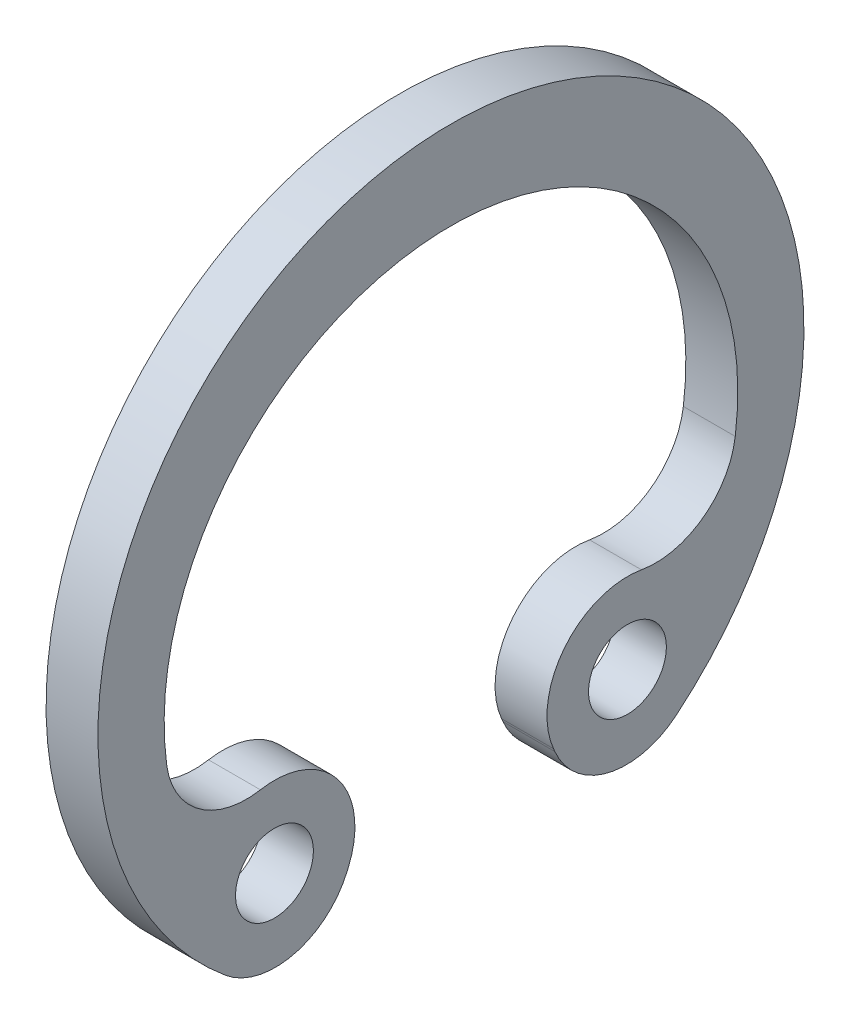
ISO-10303-21;
HEADER;
FILE_DESCRIPTION(('STEP AP214'),'2;1');
FILE_NAME('part.step','',(''),(''),'','','');
FILE_SCHEMA(('AUTOMOTIVE_DESIGN { 1 0 10303 214 1 1 1 1 }'));
ENDSEC;
DATA;
#1=APPLICATION_CONTEXT('core data for automotive mechanical design processes');
#2=APPLICATION_PROTOCOL_DEFINITION('international standard','automotive_design',2000,#1);
#3=PRODUCT_CONTEXT('',#1,'mechanical');
#4=PRODUCT('Part','Part','',(#3));
#5=PRODUCT_RELATED_PRODUCT_CATEGORY('part','',(#4));
#6=PRODUCT_DEFINITION_FORMATION('','',#4);
#7=PRODUCT_DEFINITION_CONTEXT('part definition',#1,'design');
#8=PRODUCT_DEFINITION('design','',#6,#7);
#9=PRODUCT_DEFINITION_SHAPE('','',#8);
#10=(LENGTH_UNIT() NAMED_UNIT(*) SI_UNIT(.MILLI.,.METRE.));
#11=(NAMED_UNIT(*) PLANE_ANGLE_UNIT() SI_UNIT($,.RADIAN.));
#12=(NAMED_UNIT(*) SI_UNIT($,.STERADIAN.) SOLID_ANGLE_UNIT());
#13=UNCERTAINTY_MEASURE_WITH_UNIT(LENGTH_MEASURE(1.E-05),#10,'distance_accuracy_value','');
#14=(GEOMETRIC_REPRESENTATION_CONTEXT(3) GLOBAL_UNCERTAINTY_ASSIGNED_CONTEXT((#13)) GLOBAL_UNIT_ASSIGNED_CONTEXT((#10,
#11,#12)) REPRESENTATION_CONTEXT('',''));
#15=CARTESIAN_POINT('',(0.,0.,0.));
#16=DIRECTION('',(0.,0.,1.));
#17=DIRECTION('',(1.,0.,0.));
#18=AXIS2_PLACEMENT_3D('',#15,#16,#17);
#19=CARTESIAN_POINT('',(0.5,-4.08189315250606,-3.38055443552168));
#20=DIRECTION('',(-1.,0.,0.));
#21=DIRECTION('',(0.,-0.77016849245769,-0.637840491992669));
#22=AXIS2_PLACEMENT_3D('',#19,#20,#21);
#23=CYLINDRICAL_SURFACE('',#22,1.49999999999988);
#24=CARTESIAN_POINT('',(-0.5,-4.08189315250606,-3.38055443552168));
#25=DIRECTION('',(1.,0.,0.));
#26=DIRECTION('',(0.,-0.393789709980458,0.919200557176456));
#27=AXIS2_PLACEMENT_3D('',#24,#25,#26);
#28=CIRCLE('',#27,1.49999999999988);
#29=CARTESIAN_POINT('',(-0.5,-4.6725777174767,-2.0017535997571));
#30=VERTEX_POINT('',#29);
#31=CARTESIAN_POINT('',(-0.5,-5.2371458911925,-4.3373151735106));
#32=VERTEX_POINT('',#31);
#33=EDGE_CURVE('E95',#30,#32,#28,.T.);
#34=ORIENTED_EDGE('',*,*,#33,.T.);
#35=DIRECTION('',(1.,0.,0.));
#36=VECTOR('',#35,1.);
#37=CARTESIAN_POINT('',(-0.5,-5.2371458911925,-4.3373151735106));
#38=LINE('',#37,#36);
#39=CARTESIAN_POINT('',(0.5,-5.2371458911925,-4.3373151735106));
#40=VERTEX_POINT('',#39);
#41=EDGE_CURVE('E109',#40,#32,#38,.F.);
#42=ORIENTED_EDGE('',*,*,#41,.F.);
#43=CARTESIAN_POINT('',(0.5,-4.08189315250606,-3.38055443552168));
#44=DIRECTION('',(-1.,0.,0.));
#45=DIRECTION('',(0.,-0.77016849245769,-0.637840491992669));
#46=AXIS2_PLACEMENT_3D('',#43,#44,#45);
#47=CIRCLE('',#46,1.49999999999988);
#48=CARTESIAN_POINT('',(0.5,-4.6725777174767,-2.0017535997571));
#49=VERTEX_POINT('',#48);
#50=EDGE_CURVE('E115',#49,#40,#47,.F.);
#51=ORIENTED_EDGE('',*,*,#50,.F.);
#52=DIRECTION('',(-1.,0.,0.));
#53=VECTOR('',#52,1.);
#54=CARTESIAN_POINT('',(0.5,-4.6725777174767,-2.0017535997571));
#55=LINE('',#54,#53);
#56=EDGE_CURVE('E103',#49,#30,#55,.T.);
#57=ORIENTED_EDGE('',*,*,#56,.T.);
#58=EDGE_LOOP('',(#34,#42,#51,#57));
#59=FACE_BOUND('',#58,.T.);
#60=ADVANCED_FACE('F16',(#59),#23,.T.);
#61=CARTESIAN_POINT('',(0.5,0.,0.));
#62=DIRECTION('',(-1.,0.,0.));
#63=DIRECTION('',(0.,1.,2.61036279871098E-08));
#64=AXIS2_PLACEMENT_3D('',#61,#62,#63);
#65=CYLINDRICAL_SURFACE('',#64,6.8);
#66=ORIENTED_EDGE('',*,*,#41,.T.);
#67=CARTESIAN_POINT('',(-0.5,0.,0.));
#68=DIRECTION('',(1.,0.,0.));
#69=DIRECTION('',(0.,-0.770168513410663,-0.637840466692738));
#70=AXIS2_PLACEMENT_3D('',#67,#68,#69);
#71=CIRCLE('',#70,6.8);
#72=CARTESIAN_POINT('',(-0.5,-5.23714593151701,4.3373151248203));
#73=VERTEX_POINT('',#72);
#74=EDGE_CURVE('E91',#32,#73,#71,.T.);
#75=ORIENTED_EDGE('',*,*,#74,.T.);
#76=DIRECTION('',(1.,0.,0.));
#77=VECTOR('',#76,1.);
#78=CARTESIAN_POINT('',(-0.5,-5.237145931517,4.3373151248203));
#79=LINE('',#78,#77);
#80=CARTESIAN_POINT('',(0.5,-5.237145931517,4.3373151248203));
#81=VERTEX_POINT('',#80);
#82=EDGE_CURVE('E102',#81,#73,#79,.F.);
#83=ORIENTED_EDGE('',*,*,#82,.F.);
#84=CARTESIAN_POINT('',(0.5,0.,0.));
#85=DIRECTION('',(-1.,0.,0.));
#86=DIRECTION('',(0.,-0.770168519340737,0.637840459532395));
#87=AXIS2_PLACEMENT_3D('',#84,#85,#86);
#88=CIRCLE('',#87,6.8);
#89=EDGE_CURVE('E114',#40,#81,#88,.F.);
#90=ORIENTED_EDGE('',*,*,#89,.F.);
#91=EDGE_LOOP('',(#66,#75,#83,#90));
#92=FACE_BOUND('',#91,.T.);
#93=ADVANCED_FACE('F113',(#92),#65,.T.);
#94=CARTESIAN_POINT('',(0.5,-4.08189315250605,3.38055443552168));
#95=DIRECTION('',(-1.,0.,0.));
#96=DIRECTION('',(0.,-0.393789709980464,-0.919200557176453));
#97=AXIS2_PLACEMENT_3D('',#94,#95,#96);
#98=CYLINDRICAL_SURFACE('',#97,1.4999999999999);
#99=CARTESIAN_POINT('',(-0.5,-4.08189315250605,3.38055443552168));
#100=DIRECTION('',(1.,0.,0.));
#101=DIRECTION('',(0.,-0.770168519340689,0.637840459532453));
#102=AXIS2_PLACEMENT_3D('',#99,#100,#101);
#103=CIRCLE('',#102,1.4999999999999);
#104=CARTESIAN_POINT('',(-0.5,-4.6725777174767,2.0017535997571));
#105=VERTEX_POINT('',#104);
#106=EDGE_CURVE('E97',#73,#105,#103,.T.);
#107=ORIENTED_EDGE('',*,*,#106,.T.);
#108=DIRECTION('',(1.,0.,0.));
#109=VECTOR('',#108,1.);
#110=CARTESIAN_POINT('',(-0.5,-4.6725777174767,2.0017535997571));
#111=LINE('',#110,#109);
#112=CARTESIAN_POINT('',(0.5,-4.6725777174767,2.0017535997571));
#113=VERTEX_POINT('',#112);
#114=EDGE_CURVE('E137',#113,#105,#111,.F.);
#115=ORIENTED_EDGE('',*,*,#114,.F.);
#116=CARTESIAN_POINT('',(0.5,-4.08189315250605,3.38055443552168));
#117=DIRECTION('',(-1.,0.,0.));
#118=DIRECTION('',(0.,-0.393789709980464,-0.919200557176453));
#119=AXIS2_PLACEMENT_3D('',#116,#117,#118);
#120=CIRCLE('',#119,1.4999999999999);
#121=EDGE_CURVE('E142',#81,#113,#120,.F.);
#122=ORIENTED_EDGE('',*,*,#121,.F.);
#123=ORIENTED_EDGE('',*,*,#82,.T.);
#124=EDGE_LOOP('',(#107,#115,#122,#123));
#125=FACE_BOUND('',#124,.T.);
#126=ADVANCED_FACE('F262',(#125),#98,.T.);
#127=CARTESIAN_POINT('',(-0.5,-4.6106865382637,1.9752391363765));
#128=DIRECTION('',(0.,-0.393789709981087,-0.919200557176186));
#129=DIRECTION('',(1.,0.,0.));
#130=AXIS2_PLACEMENT_3D('',#127,#128,#129);
#131=PLANE('',#130);
#132=DIRECTION('',(0.,0.919200557176186,-0.393789709981087));
#133=VECTOR('',#132,1.);
#134=CARTESIAN_POINT('',(-0.5,-4.6725777174767,2.0017535997571));
#135=LINE('',#134,#133);
#136=CARTESIAN_POINT('',(-0.5,-4.6106865382637,1.9752391363765));
#137=VERTEX_POINT('',#136);
#138=EDGE_CURVE('E146',#105,#137,#135,.T.);
#139=ORIENTED_EDGE('',*,*,#138,.T.);
#140=DIRECTION('',(1.,0.,0.));
#141=VECTOR('',#140,1.);
#142=CARTESIAN_POINT('',(-0.5,-4.6106865382637,1.9752391363765));
#143=LINE('',#142,#141);
#144=CARTESIAN_POINT('',(0.5,-4.6106865382637,1.9752391363765));
#145=VERTEX_POINT('',#144);
#146=EDGE_CURVE('E151',#145,#137,#143,.F.);
#147=ORIENTED_EDGE('',*,*,#146,.F.);
#148=DIRECTION('',(0.,-0.919200557176186,0.393789709981087));
#149=VECTOR('',#148,1.);
#150=CARTESIAN_POINT('',(0.5,-4.6106865382637,1.9752391363765));
#151=LINE('',#150,#149);
#152=EDGE_CURVE('E156',#113,#145,#151,.F.);
#153=ORIENTED_EDGE('',*,*,#152,.F.);
#154=ORIENTED_EDGE('',*,*,#114,.T.);
#155=EDGE_LOOP('',(#139,#147,#153,#154));
#156=FACE_BOUND('',#155,.T.);
#157=ADVANCED_FACE('F267',(#156),#131,.T.);
#158=CARTESIAN_POINT('',(0.5,-4.000312487794,3.4000000000001));
#159=DIRECTION('',(-1.,0.,0.));
#160=DIRECTION('',(0.,0.984684516430987,0.174345642621411));
#161=AXIS2_PLACEMENT_3D('',#158,#159,#160);
#162=CYLINDRICAL_SURFACE('',#161,1.55000000000008);
#163=CARTESIAN_POINT('',(-0.5,-4.000312487794,3.4000000000001));
#164=DIRECTION('',(1.,0.,0.));
#165=DIRECTION('',(0.,-0.393789709980428,-0.919200557176469));
#166=AXIS2_PLACEMENT_3D('',#163,#164,#165);
#167=CIRCLE('',#166,1.55000000000008);
#168=CARTESIAN_POINT('',(-0.5,-2.4740514873259,3.6702357460633));
#169=VERTEX_POINT('',#168);
#170=EDGE_CURVE('E160',#137,#169,#167,.T.);
#171=ORIENTED_EDGE('',*,*,#170,.T.);
#172=DIRECTION('',(1.,0.,0.));
#173=VECTOR('',#172,1.);
#174=CARTESIAN_POINT('',(-0.5,-2.4740514873259,3.6702357460633));
#175=LINE('',#174,#173);
#176=CARTESIAN_POINT('',(0.5,-2.4740514873259,3.6702357460633));
#177=VERTEX_POINT('',#176);
#178=EDGE_CURVE('E165',#177,#169,#175,.F.);
#179=ORIENTED_EDGE('',*,*,#178,.F.);
#180=CARTESIAN_POINT('',(0.5,-4.000312487794,3.4000000000001));
#181=DIRECTION('',(-1.,0.,0.));
#182=DIRECTION('',(0.,0.984684516430987,0.174345642621411));
#183=AXIS2_PLACEMENT_3D('',#180,#181,#182);
#184=CIRCLE('',#183,1.55000000000008);
#185=EDGE_CURVE('E170',#145,#177,#184,.F.);
#186=ORIENTED_EDGE('',*,*,#185,.F.);
#187=ORIENTED_EDGE('',*,*,#146,.T.);
#188=EDGE_LOOP('',(#171,#179,#186,#187));
#189=FACE_BOUND('',#188,.T.);
#190=ADVANCED_FACE('F271',(#189),#162,.T.);
#191=CARTESIAN_POINT('',(0.5,-0.947790476466132,3.94047143343487));
#192=DIRECTION('',(-1.,0.,0.));
#193=DIRECTION('',(0.,-0.984684523135361,-0.17434560475586));
#194=AXIS2_PLACEMENT_3D('',#191,#192,#193);
#195=CYLINDRICAL_SURFACE('',#194,1.54999999999995);
#196=CARTESIAN_POINT('',(-0.5,-0.947790476466132,3.94047143343487));
#197=DIRECTION('',(-1.,0.,0.));
#198=DIRECTION('',(0.,-0.984684523135361,-0.17434560475586));
#199=AXIS2_PLACEMENT_3D('',#196,#197,#198);
#200=CIRCLE('',#199,1.54999999999995);
#201=CARTESIAN_POINT('',(-0.5,-1.1516458823837,5.4770074640824));
#202=VERTEX_POINT('',#201);
#203=EDGE_CURVE('E174',#202,#169,#200,.F.);
#204=ORIENTED_EDGE('',*,*,#203,.F.);
#205=DIRECTION('',(1.,0.,0.));
#206=VECTOR('',#205,1.);
#207=CARTESIAN_POINT('',(-0.5,-1.1516458823837,5.4770074640824));
#208=LINE('',#207,#206);
#209=CARTESIAN_POINT('',(0.5,-1.1516458823837,5.4770074640824));
#210=VERTEX_POINT('',#209);
#211=EDGE_CURVE('E178',#210,#202,#208,.F.);
#212=ORIENTED_EDGE('',*,*,#211,.F.);
#213=CARTESIAN_POINT('',(0.5,-0.947790476466132,3.94047143343487));
#214=DIRECTION('',(1.,0.,0.));
#215=DIRECTION('',(0.,-0.131519616721015,0.991313568159721));
#216=AXIS2_PLACEMENT_3D('',#213,#214,#215);
#217=CIRCLE('',#216,1.54999999999995);
#218=EDGE_CURVE('E183',#210,#177,#217,.T.);
#219=ORIENTED_EDGE('',*,*,#218,.T.);
#220=ORIENTED_EDGE('',*,*,#178,.T.);
#221=EDGE_LOOP('',(#204,#212,#219,#220));
#222=FACE_BOUND('',#221,.T.);
#223=ADVANCED_FACE('F275',(#222),#195,.F.);
#224=CARTESIAN_POINT('',(0.5,-0.424999999999961,0.));
#225=DIRECTION('',(-1.,0.,0.));
#226=DIRECTION('',(0.,-0.13151961672104,0.991313568159717));
#227=AXIS2_PLACEMENT_3D('',#224,#225,#226);
#228=CYLINDRICAL_SURFACE('',#227,5.525);
#229=ORIENTED_EDGE('',*,*,#211,.T.);
#230=CARTESIAN_POINT('',(-0.5,-0.424999999999961,0.));
#231=DIRECTION('',(-1.,0.,0.));
#232=DIRECTION('',(0.,-0.131519616721039,0.991313568159718));
#233=AXIS2_PLACEMENT_3D('',#230,#231,#232);
#234=CIRCLE('',#233,5.525);
#235=CARTESIAN_POINT('',(-0.5,-1.15164588238371,-5.47700746408244));
#236=VERTEX_POINT('',#235);
#237=EDGE_CURVE('E188',#236,#202,#234,.F.);
#238=ORIENTED_EDGE('',*,*,#237,.F.);
#239=DIRECTION('',(1.,0.,0.));
#240=VECTOR('',#239,1.);
#241=CARTESIAN_POINT('',(-0.5,-1.15164588238371,-5.47700746408244));
#242=LINE('',#241,#240);
#243=CARTESIAN_POINT('',(0.5,-1.15164588238371,-5.47700746408244));
#244=VERTEX_POINT('',#243);
#245=EDGE_CURVE('E192',#244,#236,#242,.F.);
#246=ORIENTED_EDGE('',*,*,#245,.F.);
#247=CARTESIAN_POINT('',(0.5,-0.424999999999961,0.));
#248=DIRECTION('',(1.,0.,0.));
#249=DIRECTION('',(0.,-0.13151961672104,-0.991313568159717));
#250=AXIS2_PLACEMENT_3D('',#247,#248,#249);
#251=CIRCLE('',#250,5.525);
#252=EDGE_CURVE('E197',#244,#210,#251,.T.);
#253=ORIENTED_EDGE('',*,*,#252,.T.);
#254=EDGE_LOOP('',(#229,#238,#246,#253));
#255=FACE_BOUND('',#254,.T.);
#256=ADVANCED_FACE('F279',(#255),#228,.F.);
#257=CARTESIAN_POINT('',(0.5,-0.947790476466091,-3.9404714334348));
#258=DIRECTION('',(-1.,0.,0.));
#259=DIRECTION('',(0.,-0.131519616721037,-0.991313568159718));
#260=AXIS2_PLACEMENT_3D('',#257,#258,#259);
#261=CYLINDRICAL_SURFACE('',#260,1.55000000000003);
#262=CARTESIAN_POINT('',(-0.5,-0.947790476466091,-3.9404714334348));
#263=DIRECTION('',(-1.,0.,0.));
#264=DIRECTION('',(0.,-0.131519616721038,-0.991313568159718));
#265=AXIS2_PLACEMENT_3D('',#262,#263,#264);
#266=CIRCLE('',#265,1.55000000000003);
#267=CARTESIAN_POINT('',(-0.5,-2.4740514903455,-3.6702357631174));
#268=VERTEX_POINT('',#267);
#269=EDGE_CURVE('E202',#268,#236,#266,.F.);
#270=ORIENTED_EDGE('',*,*,#269,.F.);
#271=DIRECTION('',(1.,0.,0.));
#272=VECTOR('',#271,1.);
#273=CARTESIAN_POINT('',(-0.5,-2.4740514903455,-3.6702357631174));
#274=LINE('',#273,#272);
#275=CARTESIAN_POINT('',(0.5,-2.4740514903455,-3.6702357631174));
#276=VERTEX_POINT('',#275);
#277=EDGE_CURVE('E206',#276,#268,#274,.F.);
#278=ORIENTED_EDGE('',*,*,#277,.F.);
#279=CARTESIAN_POINT('',(0.5,-0.947790476466091,-3.9404714334348));
#280=DIRECTION('',(1.,0.,0.));
#281=DIRECTION('',(0.,-0.98468452508347,0.17434559375316));
#282=AXIS2_PLACEMENT_3D('',#279,#280,#281);
#283=CIRCLE('',#282,1.55000000000003);
#284=EDGE_CURVE('E211',#276,#244,#283,.T.);
#285=ORIENTED_EDGE('',*,*,#284,.T.);
#286=ORIENTED_EDGE('',*,*,#245,.T.);
#287=EDGE_LOOP('',(#270,#278,#285,#286));
#288=FACE_BOUND('',#287,.T.);
#289=ADVANCED_FACE('F283',(#288),#261,.F.);
#290=CARTESIAN_POINT('',(0.5,-4.00031248779391,-3.39999999999993));
#291=DIRECTION('',(-1.,0.,0.));
#292=DIRECTION('',(0.,-0.39378970998052,0.919200557176429));
#293=AXIS2_PLACEMENT_3D('',#290,#291,#292);
#294=CYLINDRICAL_SURFACE('',#293,1.54999999999996);
#295=CARTESIAN_POINT('',(-0.5,-4.00031248779391,-3.39999999999993));
#296=DIRECTION('',(1.,0.,0.));
#297=DIRECTION('',(0.,0.984684514482866,-0.174345653624178));
#298=AXIS2_PLACEMENT_3D('',#295,#296,#297);
#299=CIRCLE('',#298,1.54999999999996);
#300=CARTESIAN_POINT('',(-0.5,-4.6106865382637,-1.9752391363765));
#301=VERTEX_POINT('',#300);
#302=EDGE_CURVE('E216',#268,#301,#299,.T.);
#303=ORIENTED_EDGE('',*,*,#302,.T.);
#304=DIRECTION('',(1.,0.,0.));
#305=VECTOR('',#304,1.);
#306=CARTESIAN_POINT('',(-0.5,-4.6106865382637,-1.9752391363765));
#307=LINE('',#306,#305);
#308=CARTESIAN_POINT('',(0.5,-4.6106865382637,-1.9752391363765));
#309=VERTEX_POINT('',#308);
#310=EDGE_CURVE('E220',#309,#301,#307,.F.);
#311=ORIENTED_EDGE('',*,*,#310,.F.);
#312=CARTESIAN_POINT('',(0.5,-4.00031248779391,-3.39999999999993));
#313=DIRECTION('',(-1.,0.,0.));
#314=DIRECTION('',(0.,-0.393789709980519,0.919200557176429));
#315=AXIS2_PLACEMENT_3D('',#312,#313,#314);
#316=CIRCLE('',#315,1.54999999999996);
#317=EDGE_CURVE('E31',#276,#309,#316,.F.);
#318=ORIENTED_EDGE('',*,*,#317,.F.);
#319=ORIENTED_EDGE('',*,*,#277,.T.);
#320=EDGE_LOOP('',(#303,#311,#318,#319));
#321=FACE_BOUND('',#320,.T.);
#322=ADVANCED_FACE('F287',(#321),#294,.T.);
#323=CARTESIAN_POINT('',(-0.5,-4.6725777174767,-2.0017535997571));
#324=DIRECTION('',(0.,-0.393789709981087,0.919200557176186));
#325=DIRECTION('',(1.,0.,0.));
#326=AXIS2_PLACEMENT_3D('',#323,#324,#325);
#327=PLANE('',#326);
#328=DIRECTION('',(0.,-0.919200557176187,-0.393789709981086));
#329=VECTOR('',#328,1.);
#330=CARTESIAN_POINT('',(-0.5,-4.6106865382637,-1.9752391363765));
#331=LINE('',#330,#329);
#332=EDGE_CURVE('E39',#301,#30,#331,.T.);
#333=ORIENTED_EDGE('',*,*,#332,.T.);
#334=ORIENTED_EDGE('',*,*,#56,.F.);
#335=DIRECTION('',(0.,0.919200557176185,0.393789709981089));
#336=VECTOR('',#335,1.);
#337=CARTESIAN_POINT('',(0.5,-4.6725777174767,-2.0017535997571));
#338=LINE('',#337,#336);
#339=EDGE_CURVE('E231',#309,#49,#338,.F.);
#340=ORIENTED_EDGE('',*,*,#339,.F.);
#341=ORIENTED_EDGE('',*,*,#310,.T.);
#342=EDGE_LOOP('',(#333,#334,#340,#341));
#343=FACE_BOUND('',#342,.T.);
#344=ADVANCED_FACE('F291',(#343),#327,.T.);
#345=CARTESIAN_POINT('',(0.5,-5.59718118947309,6.98264395632624));
#346=DIRECTION('',(1.,0.,0.));
#347=DIRECTION('',(0.,0.,-1.));
#348=AXIS2_PLACEMENT_3D('',#345,#346,#347);
#349=PLANE('',#348);
#350=ORIENTED_EDGE('',*,*,#50,.T.);
#351=ORIENTED_EDGE('',*,*,#89,.T.);
#352=ORIENTED_EDGE('',*,*,#121,.T.);
#353=ORIENTED_EDGE('',*,*,#152,.T.);
#354=ORIENTED_EDGE('',*,*,#185,.T.);
#355=ORIENTED_EDGE('',*,*,#218,.F.);
#356=ORIENTED_EDGE('',*,*,#252,.F.);
#357=ORIENTED_EDGE('',*,*,#284,.F.);
#358=ORIENTED_EDGE('',*,*,#317,.T.);
#359=ORIENTED_EDGE('',*,*,#339,.T.);
#360=EDGE_LOOP('',(#350,#351,#352,#353,#354,#355,#356,#357,#358,#359));
#361=FACE_BOUND('',#360,.T.);
#362=CARTESIAN_POINT('',(0.5,-4.0003124877939,-3.4));
#363=DIRECTION('',(-1.,0.,0.));
#364=DIRECTION('',(0.,-1.42053860230366E-07,-0.99999999999999));
#365=AXIS2_PLACEMENT_3D('',#362,#363,#364);
#366=CIRCLE('',#365,0.75);
#367=CARTESIAN_POINT('',(0.5,-4.00031259433429,-4.14999999999999));
#368=VERTEX_POINT('',#367);
#369=EDGE_CURVE('E235',#368,#368,#366,.F.);
#370=ORIENTED_EDGE('',*,*,#369,.F.);
#371=EDGE_LOOP('',(#370));
#372=FACE_BOUND('',#371,.T.);
#373=CARTESIAN_POINT('',(0.5,-4.0003124877939,3.4));
#374=DIRECTION('',(-1.,0.,0.));
#375=DIRECTION('',(0.,0.,-1.));
#376=AXIS2_PLACEMENT_3D('',#373,#374,#375);
#377=CIRCLE('',#376,0.75);
#378=CARTESIAN_POINT('',(0.5,-4.0003124877939,2.65));
#379=VERTEX_POINT('',#378);
#380=EDGE_CURVE('E240',#379,#379,#377,.F.);
#381=ORIENTED_EDGE('',*,*,#380,.F.);
#382=EDGE_LOOP('',(#381));
#383=FACE_BOUND('',#382,.T.);
#384=ADVANCED_FACE('F255',(#361,#372,#383),#349,.T.);
#385=CARTESIAN_POINT('',(-0.5,-5.59718118947309,6.96426005444767));
#386=DIRECTION('',(-1.,0.,0.));
#387=DIRECTION('',(0.,1.,0.));
#388=AXIS2_PLACEMENT_3D('',#385,#386,#387);
#389=PLANE('',#388);
#390=ORIENTED_EDGE('',*,*,#74,.F.);
#391=ORIENTED_EDGE('',*,*,#33,.F.);
#392=ORIENTED_EDGE('',*,*,#332,.F.);
#393=ORIENTED_EDGE('',*,*,#302,.F.);
#394=ORIENTED_EDGE('',*,*,#269,.T.);
#395=ORIENTED_EDGE('',*,*,#237,.T.);
#396=ORIENTED_EDGE('',*,*,#203,.T.);
#397=ORIENTED_EDGE('',*,*,#170,.F.);
#398=ORIENTED_EDGE('',*,*,#138,.F.);
#399=ORIENTED_EDGE('',*,*,#106,.F.);
#400=EDGE_LOOP('',(#390,#391,#392,#393,#394,#395,#396,#397,#398,#399));
#401=FACE_BOUND('',#400,.T.);
#402=CARTESIAN_POINT('',(-0.5,-4.0003124877939,-3.4));
#403=DIRECTION('',(1.,0.,0.));
#404=DIRECTION('',(0.,0.,1.));
#405=AXIS2_PLACEMENT_3D('',#402,#403,#404);
#406=CIRCLE('',#405,0.75);
#407=CARTESIAN_POINT('',(-0.5,-4.0003124877939,-2.65));
#408=VERTEX_POINT('',#407);
#409=EDGE_CURVE('E24',#408,#408,#406,.T.);
#410=ORIENTED_EDGE('',*,*,#409,.T.);
#411=EDGE_LOOP('',(#410));
#412=FACE_BOUND('',#411,.T.);
#413=CARTESIAN_POINT('',(-0.5,-4.0003124877939,3.4));
#414=DIRECTION('',(1.,0.,0.));
#415=DIRECTION('',(0.,-1.42053860230366E-07,0.99999999999999));
#416=AXIS2_PLACEMENT_3D('',#413,#414,#415);
#417=CIRCLE('',#416,0.75);
#418=CARTESIAN_POINT('',(-0.5,-4.00031259433429,4.14999999999999));
#419=VERTEX_POINT('',#418);
#420=EDGE_CURVE('E11',#419,#419,#417,.T.);
#421=ORIENTED_EDGE('',*,*,#420,.T.);
#422=EDGE_LOOP('',(#421));
#423=FACE_BOUND('',#422,.T.);
#424=ADVANCED_FACE('F93',(#401,#412,#423),#389,.T.);
#425=CARTESIAN_POINT('',(0.5,-4.0003124877939,-3.4));
#426=DIRECTION('',(-1.,0.,0.));
#427=DIRECTION('',(0.,1.42053860352826E-07,-0.99999999999999));
#428=AXIS2_PLACEMENT_3D('',#425,#426,#427);
#429=CYLINDRICAL_SURFACE('',#428,0.75);
#430=ORIENTED_EDGE('',*,*,#369,.T.);
#431=EDGE_LOOP('',(#430));
#432=FACE_BOUND('',#431,.T.);
#433=ORIENTED_EDGE('',*,*,#409,.F.);
#434=EDGE_LOOP('',(#433));
#435=FACE_BOUND('',#434,.T.);
#436=ADVANCED_FACE('F246',(#432,#435),#429,.F.);
#437=CARTESIAN_POINT('',(0.5,-4.0003124877939,3.4));
#438=DIRECTION('',(-1.,0.,0.));
#439=DIRECTION('',(0.,0.,-1.));
#440=AXIS2_PLACEMENT_3D('',#437,#438,#439);
#441=CYLINDRICAL_SURFACE('',#440,0.75);
#442=ORIENTED_EDGE('',*,*,#380,.T.);
#443=EDGE_LOOP('',(#442));
#444=FACE_BOUND('',#443,.T.);
#445=ORIENTED_EDGE('',*,*,#420,.F.);
#446=EDGE_LOOP('',(#445));
#447=FACE_BOUND('',#446,.T.);
#448=ADVANCED_FACE('F18',(#444,#447),#441,.F.);
#449=CLOSED_SHELL('',(#60,#93,#126,#157,#190,#223,#256,#289,#322,#344,#384,#424,#436,#448));
#450=MANIFOLD_SOLID_BREP('B1',#449);
#451=ADVANCED_BREP_SHAPE_REPRESENTATION('',(#18,#450),#14);
#452=SHAPE_DEFINITION_REPRESENTATION(#9,#451);
ENDSEC;
END-ISO-10303-21;
